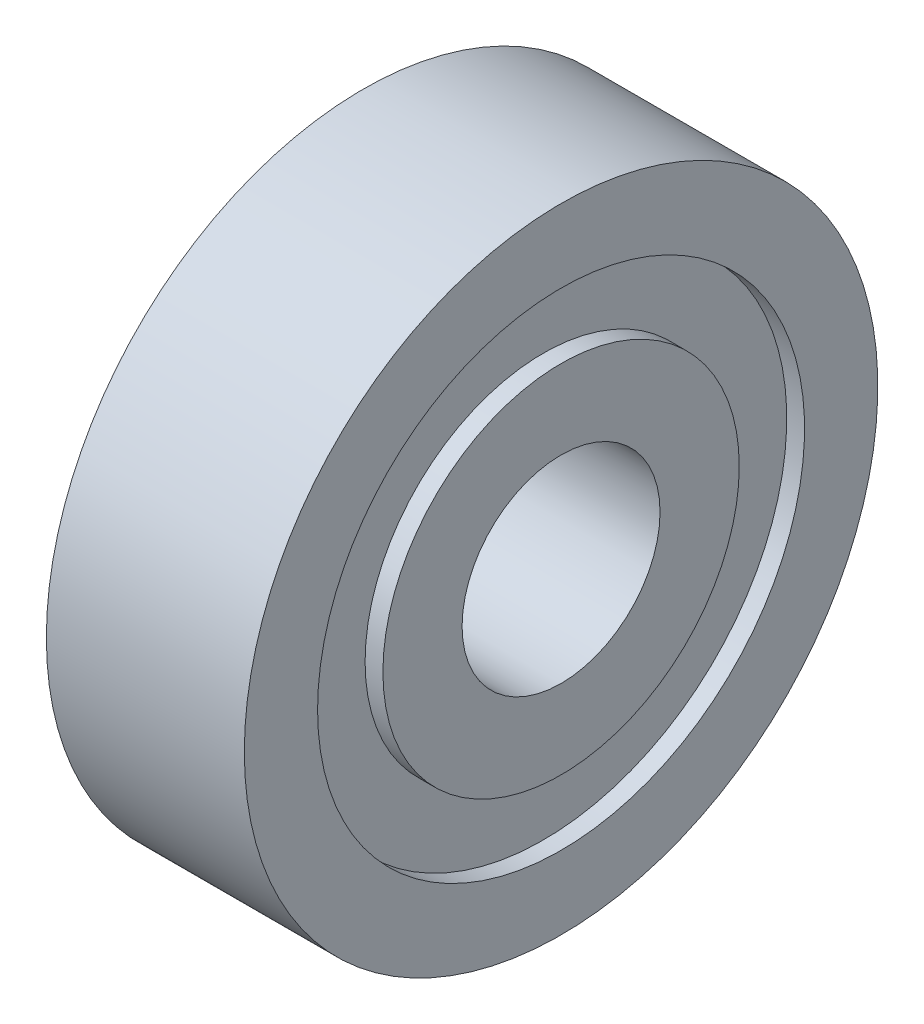
ISO-10303-21;
HEADER;
FILE_DESCRIPTION(('STEP AP214'),'2;1');
FILE_NAME('part.step','',(''),(''),'','','');
FILE_SCHEMA(('AUTOMOTIVE_DESIGN { 1 0 10303 214 1 1 1 1 }'));
ENDSEC;
DATA;
#1=APPLICATION_CONTEXT('core data for automotive mechanical design processes');
#2=APPLICATION_PROTOCOL_DEFINITION('international standard','automotive_design',2000,#1);
#3=PRODUCT_CONTEXT('',#1,'mechanical');
#4=PRODUCT('Part','Part','',(#3));
#5=PRODUCT_RELATED_PRODUCT_CATEGORY('part','',(#4));
#6=PRODUCT_DEFINITION_FORMATION('','',#4);
#7=PRODUCT_DEFINITION_CONTEXT('part definition',#1,'design');
#8=PRODUCT_DEFINITION('design','',#6,#7);
#9=PRODUCT_DEFINITION_SHAPE('','',#8);
#10=(LENGTH_UNIT() NAMED_UNIT(*) SI_UNIT(.MILLI.,.METRE.));
#11=(NAMED_UNIT(*) PLANE_ANGLE_UNIT() SI_UNIT($,.RADIAN.));
#12=(NAMED_UNIT(*) SI_UNIT($,.STERADIAN.) SOLID_ANGLE_UNIT());
#13=UNCERTAINTY_MEASURE_WITH_UNIT(LENGTH_MEASURE(1.E-05),#10,'distance_accuracy_value','');
#14=(GEOMETRIC_REPRESENTATION_CONTEXT(3) GLOBAL_UNCERTAINTY_ASSIGNED_CONTEXT((#13)) GLOBAL_UNIT_ASSIGNED_CONTEXT((#10,
#11,#12)) REPRESENTATION_CONTEXT('',''));
#15=CARTESIAN_POINT('',(0.,0.,0.));
#16=DIRECTION('',(0.,0.,1.));
#17=DIRECTION('',(1.,0.,0.));
#18=AXIS2_PLACEMENT_3D('',#15,#16,#17);
#19=CARTESIAN_POINT('',(0.,0.,0.));
#20=DIRECTION('',(1.,0.,0.));
#21=DIRECTION('',(0.,0.,-1.));
#22=AXIS2_PLACEMENT_3D('',#19,#20,#21);
#23=CYLINDRICAL_SURFACE('',#22,4.5);
#24=DIRECTION('',(-1.,0.,0.));
#25=VECTOR('',#24,1.);
#26=CARTESIAN_POINT('',(0.,0.,4.5));
#27=LINE('',#26,#25);
#28=CARTESIAN_POINT('',(-1.95,0.,4.5));
#29=VERTEX_POINT('',#28);
#30=CARTESIAN_POINT('',(-2.5,0.,4.5));
#31=VERTEX_POINT('',#30);
#32=EDGE_CURVE('E11',#29,#31,#27,.T.);
#33=ORIENTED_EDGE('',*,*,#32,.F.);
#34=CARTESIAN_POINT('',(-1.95,0.,0.));
#35=DIRECTION('',(1.,0.,0.));
#36=DIRECTION('',(0.,0.,-1.));
#37=AXIS2_PLACEMENT_3D('',#34,#35,#36);
#38=CIRCLE('',#37,4.5);
#39=EDGE_CURVE('E61',#29,#29,#38,.F.);
#40=ORIENTED_EDGE('',*,*,#39,.T.);
#41=ORIENTED_EDGE('',*,*,#32,.T.);
#42=CARTESIAN_POINT('',(-2.5,0.,0.));
#43=DIRECTION('',(-1.,0.,0.));
#44=DIRECTION('',(0.,0.,-1.));
#45=AXIS2_PLACEMENT_3D('',#42,#43,#44);
#46=CIRCLE('',#45,4.5);
#47=EDGE_CURVE('E148',#31,#31,#46,.T.);
#48=ORIENTED_EDGE('',*,*,#47,.F.);
#49=EDGE_LOOP('',(#33,#40,#41,#48));
#50=FACE_BOUND('',#49,.T.);
#51=ADVANCED_FACE('F45',(#50),#23,.T.);
#52=CARTESIAN_POINT('',(0.,0.,0.));
#53=DIRECTION('',(1.,0.,0.));
#54=DIRECTION('',(0.,0.,-1.));
#55=AXIS2_PLACEMENT_3D('',#52,#53,#54);
#56=CYLINDRICAL_SURFACE('',#55,6.15);
#57=CARTESIAN_POINT('',(-1.95,0.,0.));
#58=DIRECTION('',(1.,0.,0.));
#59=DIRECTION('',(0.,0.,-1.));
#60=AXIS2_PLACEMENT_3D('',#57,#58,#59);
#61=CIRCLE('',#60,6.15);
#62=CARTESIAN_POINT('',(-1.95,0.,6.15));
#63=VERTEX_POINT('',#62);
#64=EDGE_CURVE('E117',#63,#63,#61,.T.);
#65=ORIENTED_EDGE('',*,*,#64,.T.);
#66=DIRECTION('',(-1.,0.,0.));
#67=VECTOR('',#66,1.);
#68=CARTESIAN_POINT('',(0.,0.,6.15));
#69=LINE('',#68,#67);
#70=CARTESIAN_POINT('',(-2.5,0.,6.15));
#71=VERTEX_POINT('',#70);
#72=EDGE_CURVE('E114',#63,#71,#69,.T.);
#73=ORIENTED_EDGE('',*,*,#72,.T.);
#74=CARTESIAN_POINT('',(-2.5,0.,0.));
#75=DIRECTION('',(1.,0.,0.));
#76=DIRECTION('',(0.,0.,-1.));
#77=AXIS2_PLACEMENT_3D('',#74,#75,#76);
#78=CIRCLE('',#77,6.15);
#79=EDGE_CURVE('E119',#71,#71,#78,.T.);
#80=ORIENTED_EDGE('',*,*,#79,.F.);
#81=ORIENTED_EDGE('',*,*,#72,.F.);
#82=EDGE_LOOP('',(#65,#73,#80,#81));
#83=FACE_BOUND('',#82,.T.);
#84=ADVANCED_FACE('F115',(#83),#56,.F.);
#85=CARTESIAN_POINT('',(0.,0.,0.));
#86=DIRECTION('',(1.,0.,0.));
#87=DIRECTION('',(0.,0.,-1.));
#88=AXIS2_PLACEMENT_3D('',#85,#86,#87);
#89=CYLINDRICAL_SURFACE('',#88,4.5);
#90=CARTESIAN_POINT('',(2.5,0.,0.));
#91=DIRECTION('',(1.,0.,0.));
#92=DIRECTION('',(0.,0.,-1.));
#93=AXIS2_PLACEMENT_3D('',#90,#91,#92);
#94=CIRCLE('',#93,4.5);
#95=CARTESIAN_POINT('',(2.5,0.,4.5));
#96=VERTEX_POINT('',#95);
#97=EDGE_CURVE('E144',#96,#96,#94,.T.);
#98=ORIENTED_EDGE('',*,*,#97,.F.);
#99=DIRECTION('',(-1.,0.,0.));
#100=VECTOR('',#99,1.);
#101=CARTESIAN_POINT('',(0.,0.,4.5));
#102=LINE('',#101,#100);
#103=CARTESIAN_POINT('',(2.05,0.,4.5));
#104=VERTEX_POINT('',#103);
#105=EDGE_CURVE('E55',#96,#104,#102,.T.);
#106=ORIENTED_EDGE('',*,*,#105,.T.);
#107=CARTESIAN_POINT('',(2.05,0.,0.));
#108=DIRECTION('',(-1.,0.,0.));
#109=DIRECTION('',(0.,0.,-1.));
#110=AXIS2_PLACEMENT_3D('',#107,#108,#109);
#111=CIRCLE('',#110,4.5);
#112=EDGE_CURVE('E121',#104,#104,#111,.T.);
#113=ORIENTED_EDGE('',*,*,#112,.F.);
#114=ORIENTED_EDGE('',*,*,#105,.F.);
#115=EDGE_LOOP('',(#98,#106,#113,#114));
#116=FACE_BOUND('',#115,.T.);
#117=ADVANCED_FACE('F185',(#116),#89,.T.);
#118=CARTESIAN_POINT('',(-2.5,0.,0.));
#119=DIRECTION('',(1.,0.,0.));
#120=DIRECTION('',(0.,1.,0.));
#121=AXIS2_PLACEMENT_3D('',#118,#119,#120);
#122=PLANE('',#121);
#123=ORIENTED_EDGE('',*,*,#47,.T.);
#124=EDGE_LOOP('',(#123));
#125=FACE_BOUND('',#124,.T.);
#126=CARTESIAN_POINT('',(-2.5,0.,0.));
#127=DIRECTION('',(1.,0.,0.));
#128=DIRECTION('',(0.,0.,-1.));
#129=AXIS2_PLACEMENT_3D('',#126,#127,#128);
#130=CIRCLE('',#129,2.5);
#131=CARTESIAN_POINT('',(-2.5,0.,2.5));
#132=VERTEX_POINT('',#131);
#133=EDGE_CURVE('E49',#132,#132,#130,.T.);
#134=ORIENTED_EDGE('',*,*,#133,.T.);
#135=EDGE_LOOP('',(#134));
#136=FACE_BOUND('',#135,.T.);
#137=ADVANCED_FACE('F181',(#125,#136),#122,.F.);
#138=CARTESIAN_POINT('',(0.,0.,0.));
#139=DIRECTION('',(1.,0.,0.));
#140=DIRECTION('',(0.,0.,-1.));
#141=AXIS2_PLACEMENT_3D('',#138,#139,#140);
#142=CYLINDRICAL_SURFACE('',#141,2.5);
#143=DIRECTION('',(-1.,0.,0.));
#144=VECTOR('',#143,1.);
#145=CARTESIAN_POINT('',(0.,0.,2.5));
#146=LINE('',#145,#144);
#147=CARTESIAN_POINT('',(-1.95,0.,2.5));
#148=VERTEX_POINT('',#147);
#149=EDGE_CURVE('E67',#148,#132,#146,.T.);
#150=ORIENTED_EDGE('',*,*,#149,.F.);
#151=ORIENTED_EDGE('',*,*,#149,.T.);
#152=ORIENTED_EDGE('',*,*,#133,.F.);
#153=EDGE_LOOP('',(#150,#151,#152));
#154=FACE_BOUND('',#153,.T.);
#155=CARTESIAN_POINT('',(2.5,0.,2.5));
#156=VERTEX_POINT('',#155);
#157=CARTESIAN_POINT('',(2.05,0.,2.5));
#158=VERTEX_POINT('',#157);
#159=EDGE_CURVE('E168',#156,#158,#146,.T.);
#160=ORIENTED_EDGE('',*,*,#159,.T.);
#161=ORIENTED_EDGE('',*,*,#159,.F.);
#162=CARTESIAN_POINT('',(2.5,0.,0.));
#163=DIRECTION('',(-1.,0.,0.));
#164=DIRECTION('',(0.,0.,-1.));
#165=AXIS2_PLACEMENT_3D('',#162,#163,#164);
#166=CIRCLE('',#165,2.5);
#167=EDGE_CURVE('E128',#156,#156,#166,.T.);
#168=ORIENTED_EDGE('',*,*,#167,.F.);
#169=EDGE_LOOP('',(#160,#161,#168));
#170=FACE_BOUND('',#169,.T.);
#171=ADVANCED_FACE('F184',(#154,#170),#142,.F.);
#172=CARTESIAN_POINT('',(2.5,0.,0.));
#173=DIRECTION('',(1.,0.,0.));
#174=DIRECTION('',(0.,1.,0.));
#175=AXIS2_PLACEMENT_3D('',#172,#173,#174);
#176=PLANE('',#175);
#177=ORIENTED_EDGE('',*,*,#97,.T.);
#178=EDGE_LOOP('',(#177));
#179=FACE_BOUND('',#178,.T.);
#180=ORIENTED_EDGE('',*,*,#167,.T.);
#181=EDGE_LOOP('',(#180));
#182=FACE_BOUND('',#181,.T.);
#183=ADVANCED_FACE('F259',(#179,#182),#176,.T.);
#184=CARTESIAN_POINT('',(2.05,0.,0.));
#185=DIRECTION('',(1.,0.,0.));
#186=DIRECTION('',(0.,1.,0.));
#187=AXIS2_PLACEMENT_3D('',#184,#185,#186);
#188=PLANE('',#187);
#189=CARTESIAN_POINT('',(2.05,0.,0.));
#190=DIRECTION('',(-1.,0.,0.));
#191=DIRECTION('',(0.,0.,-1.));
#192=AXIS2_PLACEMENT_3D('',#189,#190,#191);
#193=CIRCLE('',#192,6.15);
#194=CARTESIAN_POINT('',(2.05,0.,6.15));
#195=VERTEX_POINT('',#194);
#196=EDGE_CURVE('E135',#195,#195,#193,.T.);
#197=ORIENTED_EDGE('',*,*,#196,.F.);
#198=EDGE_LOOP('',(#197));
#199=FACE_BOUND('',#198,.T.);
#200=ORIENTED_EDGE('',*,*,#112,.T.);
#201=EDGE_LOOP('',(#200));
#202=FACE_BOUND('',#201,.T.);
#203=ADVANCED_FACE('F278',(#199,#202),#188,.T.);
#204=CARTESIAN_POINT('',(-2.5,0.,0.));
#205=DIRECTION('',(1.,0.,0.));
#206=DIRECTION('',(0.,1.,0.));
#207=AXIS2_PLACEMENT_3D('',#204,#205,#206);
#208=PLANE('',#207);
#209=CARTESIAN_POINT('',(-2.5,0.,0.));
#210=DIRECTION('',(-1.,0.,0.));
#211=DIRECTION('',(0.,0.,-1.));
#212=AXIS2_PLACEMENT_3D('',#209,#210,#211);
#213=CIRCLE('',#212,8.);
#214=CARTESIAN_POINT('',(-2.5,0.,8.));
#215=VERTEX_POINT('',#214);
#216=EDGE_CURVE('E122',#215,#215,#213,.T.);
#217=ORIENTED_EDGE('',*,*,#216,.T.);
#218=EDGE_LOOP('',(#217));
#219=FACE_BOUND('',#218,.T.);
#220=ORIENTED_EDGE('',*,*,#79,.T.);
#221=EDGE_LOOP('',(#220));
#222=FACE_BOUND('',#221,.T.);
#223=ADVANCED_FACE('F281',(#219,#222),#208,.F.);
#224=CARTESIAN_POINT('',(0.,0.,0.));
#225=DIRECTION('',(1.,0.,0.));
#226=DIRECTION('',(0.,0.,-1.));
#227=AXIS2_PLACEMENT_3D('',#224,#225,#226);
#228=CYLINDRICAL_SURFACE('',#227,6.15);
#229=CARTESIAN_POINT('',(2.5,0.,0.));
#230=DIRECTION('',(-1.,0.,0.));
#231=DIRECTION('',(0.,0.,-1.));
#232=AXIS2_PLACEMENT_3D('',#229,#230,#231);
#233=CIRCLE('',#232,6.15);
#234=CARTESIAN_POINT('',(2.5,0.,6.15));
#235=VERTEX_POINT('',#234);
#236=EDGE_CURVE('E156',#235,#235,#233,.T.);
#237=ORIENTED_EDGE('',*,*,#236,.F.);
#238=DIRECTION('',(-1.,0.,0.));
#239=VECTOR('',#238,1.);
#240=CARTESIAN_POINT('',(0.,0.,6.15));
#241=LINE('',#240,#239);
#242=EDGE_CURVE('E139',#235,#195,#241,.T.);
#243=ORIENTED_EDGE('',*,*,#242,.T.);
#244=ORIENTED_EDGE('',*,*,#196,.T.);
#245=ORIENTED_EDGE('',*,*,#242,.F.);
#246=EDGE_LOOP('',(#237,#243,#244,#245));
#247=FACE_BOUND('',#246,.T.);
#248=ADVANCED_FACE('F323',(#247),#228,.F.);
#249=CARTESIAN_POINT('',(0.,0.,0.));
#250=DIRECTION('',(1.,0.,0.));
#251=DIRECTION('',(0.,0.,-1.));
#252=AXIS2_PLACEMENT_3D('',#249,#250,#251);
#253=CYLINDRICAL_SURFACE('',#252,8.);
#254=CARTESIAN_POINT('',(2.5,0.,0.));
#255=DIRECTION('',(1.,0.,0.));
#256=DIRECTION('',(0.,0.,-1.));
#257=AXIS2_PLACEMENT_3D('',#254,#255,#256);
#258=CIRCLE('',#257,8.);
#259=CARTESIAN_POINT('',(2.5,0.,8.));
#260=VERTEX_POINT('',#259);
#261=EDGE_CURVE('E152',#260,#260,#258,.T.);
#262=ORIENTED_EDGE('',*,*,#261,.F.);
#263=DIRECTION('',(-1.,0.,0.));
#264=VECTOR('',#263,1.);
#265=CARTESIAN_POINT('',(0.,0.,8.));
#266=LINE('',#265,#264);
#267=EDGE_CURVE('E140',#260,#215,#266,.T.);
#268=ORIENTED_EDGE('',*,*,#267,.T.);
#269=ORIENTED_EDGE('',*,*,#216,.F.);
#270=ORIENTED_EDGE('',*,*,#267,.F.);
#271=EDGE_LOOP('',(#262,#268,#269,#270));
#272=FACE_BOUND('',#271,.T.);
#273=ADVANCED_FACE('F47',(#272),#253,.T.);
#274=CARTESIAN_POINT('',(2.5,0.,0.));
#275=DIRECTION('',(1.,0.,0.));
#276=DIRECTION('',(0.,1.,0.));
#277=AXIS2_PLACEMENT_3D('',#274,#275,#276);
#278=PLANE('',#277);
#279=ORIENTED_EDGE('',*,*,#261,.T.);
#280=EDGE_LOOP('',(#279));
#281=FACE_BOUND('',#280,.T.);
#282=ORIENTED_EDGE('',*,*,#236,.T.);
#283=EDGE_LOOP('',(#282));
#284=FACE_BOUND('',#283,.T.);
#285=ADVANCED_FACE('F270',(#281,#284),#278,.T.);
#286=CARTESIAN_POINT('',(-1.95,0.,0.));
#287=DIRECTION('',(1.,0.,0.));
#288=DIRECTION('',(0.,0.,-1.));
#289=AXIS2_PLACEMENT_3D('',#286,#287,#288);
#290=PLANE('',#289);
#291=ORIENTED_EDGE('',*,*,#39,.F.);
#292=EDGE_LOOP('',(#291));
#293=FACE_BOUND('',#292,.T.);
#294=ORIENTED_EDGE('',*,*,#64,.F.);
#295=EDGE_LOOP('',(#294));
#296=FACE_BOUND('',#295,.T.);
#297=ADVANCED_FACE('F265',(#293,#296),#290,.F.);
#298=CLOSED_SHELL('',(#51,#84,#117,#137,#171,#183,#203,#223,#248,#273,#285,#297));
#299=MANIFOLD_SOLID_BREP('B2',#298);
#300=ADVANCED_BREP_SHAPE_REPRESENTATION('',(#18,#299),#14);
#301=SHAPE_DEFINITION_REPRESENTATION(#9,#300);
ENDSEC;
END-ISO-10303-21;
